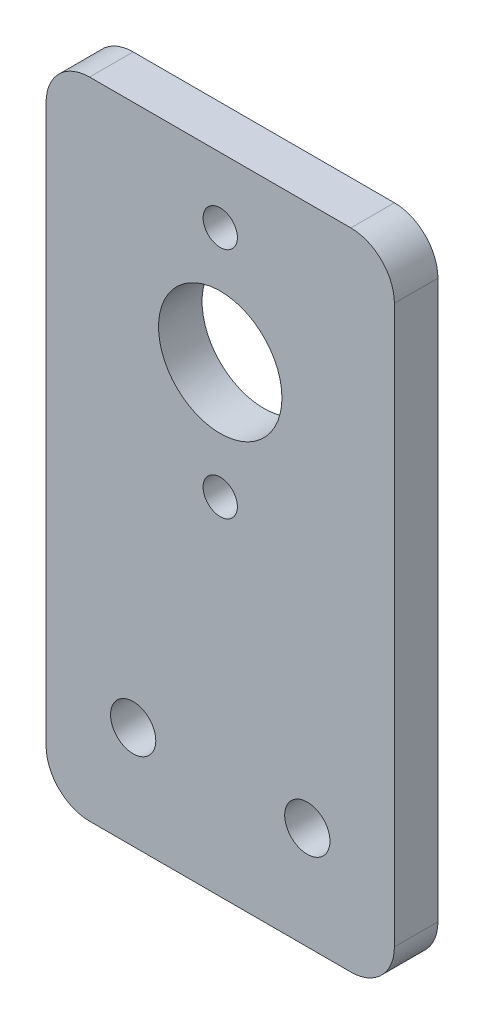
ISO-10303-21;
HEADER;
FILE_DESCRIPTION(('STEP AP214'),'2;1');
FILE_NAME('part.step','',(''),(''),'','','');
FILE_SCHEMA(('AUTOMOTIVE_DESIGN { 1 0 10303 214 1 1 1 1 }'));
ENDSEC;
DATA;
#1=APPLICATION_CONTEXT('core data for automotive mechanical design processes');
#2=APPLICATION_PROTOCOL_DEFINITION('international standard','automotive_design',2000,#1);
#3=PRODUCT_CONTEXT('',#1,'mechanical');
#4=PRODUCT('Part','Part','',(#3));
#5=PRODUCT_RELATED_PRODUCT_CATEGORY('part','',(#4));
#6=PRODUCT_DEFINITION_FORMATION('','',#4);
#7=PRODUCT_DEFINITION_CONTEXT('part definition',#1,'design');
#8=PRODUCT_DEFINITION('design','',#6,#7);
#9=PRODUCT_DEFINITION_SHAPE('','',#8);
#10=(LENGTH_UNIT() NAMED_UNIT(*) SI_UNIT(.MILLI.,.METRE.));
#11=(NAMED_UNIT(*) PLANE_ANGLE_UNIT() SI_UNIT($,.RADIAN.));
#12=(NAMED_UNIT(*) SI_UNIT($,.STERADIAN.) SOLID_ANGLE_UNIT());
#13=UNCERTAINTY_MEASURE_WITH_UNIT(LENGTH_MEASURE(1.E-05),#10,'distance_accuracy_value','');
#14=(GEOMETRIC_REPRESENTATION_CONTEXT(3) GLOBAL_UNCERTAINTY_ASSIGNED_CONTEXT((#13)) GLOBAL_UNIT_ASSIGNED_CONTEXT((#10,
#11,#12)) REPRESENTATION_CONTEXT('',''));
#15=CARTESIAN_POINT('',(0.,0.,0.));
#16=DIRECTION('',(0.,0.,1.));
#17=DIRECTION('',(1.,0.,0.));
#18=AXIS2_PLACEMENT_3D('',#15,#16,#17);
#19=CARTESIAN_POINT('',(12.7,-23.5,3.175));
#20=DIRECTION('',(-1.,0.,0.));
#21=DIRECTION('',(0.,0.,1.));
#22=AXIS2_PLACEMENT_3D('',#19,#20,#21);
#23=PLANE('',#22);
#24=DIRECTION('',(0.,1.,0.));
#25=VECTOR('',#24,1.);
#26=CARTESIAN_POINT('',(12.7,-23.5,3.175));
#27=LINE('',#26,#25);
#28=CARTESIAN_POINT('',(12.7,-20.325,3.175));
#29=VERTEX_POINT('',#28);
#30=CARTESIAN_POINT('',(12.7,20.325,3.175));
#31=VERTEX_POINT('',#30);
#32=EDGE_CURVE('E140',#29,#31,#27,.T.);
#33=ORIENTED_EDGE('',*,*,#32,.F.);
#34=DIRECTION('',(0.,0.,-1.));
#35=VECTOR('',#34,1.);
#36=CARTESIAN_POINT('',(12.7,-20.325,3.175));
#37=LINE('',#36,#35);
#38=CARTESIAN_POINT('',(12.7,-20.325,0.));
#39=VERTEX_POINT('',#38);
#40=EDGE_CURVE('E180',#29,#39,#37,.T.);
#41=ORIENTED_EDGE('',*,*,#40,.T.);
#42=DIRECTION('',(0.,1.,0.));
#43=VECTOR('',#42,1.);
#44=CARTESIAN_POINT('',(12.7,-23.5,0.));
#45=LINE('',#44,#43);
#46=CARTESIAN_POINT('',(12.7,20.325,0.));
#47=VERTEX_POINT('',#46);
#48=EDGE_CURVE('E238',#39,#47,#45,.T.);
#49=ORIENTED_EDGE('',*,*,#48,.T.);
#50=DIRECTION('',(0.,0.,-1.));
#51=VECTOR('',#50,1.);
#52=CARTESIAN_POINT('',(12.7,20.325,3.175));
#53=LINE('',#52,#51);
#54=EDGE_CURVE('E177',#47,#31,#53,.F.);
#55=ORIENTED_EDGE('',*,*,#54,.T.);
#56=EDGE_LOOP('',(#33,#41,#49,#55));
#57=FACE_BOUND('',#56,.T.);
#58=ADVANCED_FACE('F44',(#57),#23,.F.);
#59=CARTESIAN_POINT('',(-12.7,23.5,3.175));
#60=DIRECTION('',(0.,-1.,0.));
#61=DIRECTION('',(0.,0.,-1.));
#62=AXIS2_PLACEMENT_3D('',#59,#60,#61);
#63=PLANE('',#62);
#64=DIRECTION('',(-1.,0.,0.));
#65=VECTOR('',#64,1.);
#66=CARTESIAN_POINT('',(-12.7,23.5,3.175));
#67=LINE('',#66,#65);
#68=CARTESIAN_POINT('',(9.525,23.5,3.175));
#69=VERTEX_POINT('',#68);
#70=CARTESIAN_POINT('',(-9.525,23.5,3.175));
#71=VERTEX_POINT('',#70);
#72=EDGE_CURVE('E146',#69,#71,#67,.T.);
#73=ORIENTED_EDGE('',*,*,#72,.F.);
#74=DIRECTION('',(0.,0.,-1.));
#75=VECTOR('',#74,1.);
#76=CARTESIAN_POINT('',(9.525,23.5,3.175));
#77=LINE('',#76,#75);
#78=CARTESIAN_POINT('',(9.525,23.5,0.));
#79=VERTEX_POINT('',#78);
#80=EDGE_CURVE('E11',#69,#79,#77,.T.);
#81=ORIENTED_EDGE('',*,*,#80,.T.);
#82=DIRECTION('',(-1.,0.,0.));
#83=VECTOR('',#82,1.);
#84=CARTESIAN_POINT('',(-12.7,23.5,0.));
#85=LINE('',#84,#83);
#86=CARTESIAN_POINT('',(-9.525,23.5,0.));
#87=VERTEX_POINT('',#86);
#88=EDGE_CURVE('E148',#79,#87,#85,.T.);
#89=ORIENTED_EDGE('',*,*,#88,.T.);
#90=DIRECTION('',(0.,0.,-1.));
#91=VECTOR('',#90,1.);
#92=CARTESIAN_POINT('',(-9.525,23.5,3.175));
#93=LINE('',#92,#91);
#94=EDGE_CURVE('E53',#87,#71,#93,.F.);
#95=ORIENTED_EDGE('',*,*,#94,.T.);
#96=EDGE_LOOP('',(#73,#81,#89,#95));
#97=FACE_BOUND('',#96,.T.);
#98=ADVANCED_FACE('F325',(#97),#63,.F.);
#99=CARTESIAN_POINT('',(-12.7,-23.5,3.175));
#100=DIRECTION('',(1.,0.,0.));
#101=DIRECTION('',(0.,0.,-1.));
#102=AXIS2_PLACEMENT_3D('',#99,#100,#101);
#103=PLANE('',#102);
#104=DIRECTION('',(0.,-1.,0.));
#105=VECTOR('',#104,1.);
#106=CARTESIAN_POINT('',(-12.7,-23.5,0.));
#107=LINE('',#106,#105);
#108=CARTESIAN_POINT('',(-12.7,20.325,0.));
#109=VERTEX_POINT('',#108);
#110=CARTESIAN_POINT('',(-12.7,-20.325,0.));
#111=VERTEX_POINT('',#110);
#112=EDGE_CURVE('E141',#109,#111,#107,.T.);
#113=ORIENTED_EDGE('',*,*,#112,.T.);
#114=DIRECTION('',(0.,0.,-1.));
#115=VECTOR('',#114,1.);
#116=CARTESIAN_POINT('',(-12.7,-20.325,3.175));
#117=LINE('',#116,#115);
#118=CARTESIAN_POINT('',(-12.7,-20.325,3.175));
#119=VERTEX_POINT('',#118);
#120=EDGE_CURVE('E116',#111,#119,#117,.F.);
#121=ORIENTED_EDGE('',*,*,#120,.T.);
#122=DIRECTION('',(0.,-1.,0.));
#123=VECTOR('',#122,1.);
#124=CARTESIAN_POINT('',(-12.7,-23.5,3.175));
#125=LINE('',#124,#123);
#126=CARTESIAN_POINT('',(-12.7,20.325,3.175));
#127=VERTEX_POINT('',#126);
#128=EDGE_CURVE('E218',#127,#119,#125,.T.);
#129=ORIENTED_EDGE('',*,*,#128,.F.);
#130=DIRECTION('',(0.,0.,-1.));
#131=VECTOR('',#130,1.);
#132=CARTESIAN_POINT('',(-12.7,20.325,3.175));
#133=LINE('',#132,#131);
#134=EDGE_CURVE('E122',#127,#109,#133,.T.);
#135=ORIENTED_EDGE('',*,*,#134,.T.);
#136=EDGE_LOOP('',(#113,#121,#129,#135));
#137=FACE_BOUND('',#136,.T.);
#138=ADVANCED_FACE('F322',(#137),#103,.F.);
#139=CARTESIAN_POINT('',(-12.7,-23.5,3.175));
#140=DIRECTION('',(0.,1.,0.));
#141=DIRECTION('',(0.,0.,1.));
#142=AXIS2_PLACEMENT_3D('',#139,#140,#141);
#143=PLANE('',#142);
#144=DIRECTION('',(1.,0.,0.));
#145=VECTOR('',#144,1.);
#146=CARTESIAN_POINT('',(-12.7,-23.5,3.175));
#147=LINE('',#146,#145);
#148=CARTESIAN_POINT('',(-9.525,-23.5,3.175));
#149=VERTEX_POINT('',#148);
#150=CARTESIAN_POINT('',(9.525,-23.5,3.175));
#151=VERTEX_POINT('',#150);
#152=EDGE_CURVE('E132',#149,#151,#147,.T.);
#153=ORIENTED_EDGE('',*,*,#152,.F.);
#154=DIRECTION('',(0.,0.,-1.));
#155=VECTOR('',#154,1.);
#156=CARTESIAN_POINT('',(-9.525,-23.5,3.175));
#157=LINE('',#156,#155);
#158=CARTESIAN_POINT('',(-9.525,-23.5,0.));
#159=VERTEX_POINT('',#158);
#160=EDGE_CURVE('E115',#149,#159,#157,.T.);
#161=ORIENTED_EDGE('',*,*,#160,.T.);
#162=DIRECTION('',(1.,0.,0.));
#163=VECTOR('',#162,1.);
#164=CARTESIAN_POINT('',(-12.7,-23.5,0.));
#165=LINE('',#164,#163);
#166=CARTESIAN_POINT('',(9.525,-23.5,0.));
#167=VERTEX_POINT('',#166);
#168=EDGE_CURVE('E129',#159,#167,#165,.T.);
#169=ORIENTED_EDGE('',*,*,#168,.T.);
#170=DIRECTION('',(0.,0.,-1.));
#171=VECTOR('',#170,1.);
#172=CARTESIAN_POINT('',(9.525,-23.5,3.175));
#173=LINE('',#172,#171);
#174=EDGE_CURVE('E135',#167,#151,#173,.F.);
#175=ORIENTED_EDGE('',*,*,#174,.T.);
#176=EDGE_LOOP('',(#153,#161,#169,#175));
#177=FACE_BOUND('',#176,.T.);
#178=ADVANCED_FACE('F128',(#177),#143,.F.);
#179=CARTESIAN_POINT('',(0.,0.,3.175));
#180=DIRECTION('',(0.,0.,-1.));
#181=DIRECTION('',(-1.,0.,0.));
#182=AXIS2_PLACEMENT_3D('',#179,#180,#181);
#183=PLANE('',#182);
#184=CARTESIAN_POINT('',(-6.35,-16.,3.175));
#185=DIRECTION('',(0.,0.,1.));
#186=DIRECTION('',(1.,0.,0.));
#187=AXIS2_PLACEMENT_3D('',#184,#185,#186);
#188=CIRCLE('',#187,1.65);
#189=CARTESIAN_POINT('',(-4.7,-16.,3.175));
#190=VERTEX_POINT('',#189);
#191=EDGE_CURVE('E297',#190,#190,#188,.T.);
#192=ORIENTED_EDGE('',*,*,#191,.F.);
#193=EDGE_LOOP('',(#192));
#194=FACE_BOUND('',#193,.T.);
#195=CARTESIAN_POINT('',(6.35,-16.,3.175));
#196=DIRECTION('',(0.,0.,1.));
#197=DIRECTION('',(1.,0.,0.));
#198=AXIS2_PLACEMENT_3D('',#195,#196,#197);
#199=CIRCLE('',#198,1.65);
#200=CARTESIAN_POINT('',(8.,-16.,3.175));
#201=VERTEX_POINT('',#200);
#202=EDGE_CURVE('E285',#201,#201,#199,.T.);
#203=ORIENTED_EDGE('',*,*,#202,.F.);
#204=EDGE_LOOP('',(#203));
#205=FACE_BOUND('',#204,.T.);
#206=CARTESIAN_POINT('',(0.,18.75,3.175));
#207=DIRECTION('',(0.,0.,1.));
#208=DIRECTION('',(1.,0.,0.));
#209=AXIS2_PLACEMENT_3D('',#206,#207,#208);
#210=CIRCLE('',#209,1.24999999999999);
#211=CARTESIAN_POINT('',(1.24999999999999,18.75,3.175));
#212=VERTEX_POINT('',#211);
#213=EDGE_CURVE('E273',#212,#212,#210,.T.);
#214=ORIENTED_EDGE('',*,*,#213,.F.);
#215=EDGE_LOOP('',(#214));
#216=FACE_BOUND('',#215,.T.);
#217=CARTESIAN_POINT('',(0.,1.74999999999999,3.175));
#218=DIRECTION('',(0.,0.,1.));
#219=DIRECTION('',(1.,0.,0.));
#220=AXIS2_PLACEMENT_3D('',#217,#218,#219);
#221=CIRCLE('',#220,1.24999999999999);
#222=CARTESIAN_POINT('',(1.24999999999999,1.74999999999999,3.175));
#223=VERTEX_POINT('',#222);
#224=EDGE_CURVE('E261',#223,#223,#221,.T.);
#225=ORIENTED_EDGE('',*,*,#224,.F.);
#226=EDGE_LOOP('',(#225));
#227=FACE_BOUND('',#226,.T.);
#228=CARTESIAN_POINT('',(0.,10.25,3.175));
#229=DIRECTION('',(0.,0.,1.));
#230=DIRECTION('',(1.,0.,0.));
#231=AXIS2_PLACEMENT_3D('',#228,#229,#230);
#232=CIRCLE('',#231,4.5);
#233=CARTESIAN_POINT('',(4.5,10.25,3.175));
#234=VERTEX_POINT('',#233);
#235=EDGE_CURVE('E249',#234,#234,#232,.T.);
#236=ORIENTED_EDGE('',*,*,#235,.F.);
#237=EDGE_LOOP('',(#236));
#238=FACE_BOUND('',#237,.T.);
#239=ORIENTED_EDGE('',*,*,#128,.T.);
#240=CARTESIAN_POINT('',(-9.525,-20.325,3.175));
#241=DIRECTION('',(0.,0.,-1.));
#242=DIRECTION('',(-1.,0.,0.));
#243=AXIS2_PLACEMENT_3D('',#240,#241,#242);
#244=CIRCLE('',#243,3.175);
#245=EDGE_CURVE('E174',#119,#149,#244,.F.);
#246=ORIENTED_EDGE('',*,*,#245,.T.);
#247=ORIENTED_EDGE('',*,*,#152,.T.);
#248=CARTESIAN_POINT('',(9.525,-20.325,3.175));
#249=DIRECTION('',(0.,0.,-1.));
#250=DIRECTION('',(-1.,0.,0.));
#251=AXIS2_PLACEMENT_3D('',#248,#249,#250);
#252=CIRCLE('',#251,3.175);
#253=EDGE_CURVE('E171',#151,#29,#252,.F.);
#254=ORIENTED_EDGE('',*,*,#253,.T.);
#255=ORIENTED_EDGE('',*,*,#32,.T.);
#256=CARTESIAN_POINT('',(9.525,20.325,3.175));
#257=DIRECTION('',(0.,0.,-1.));
#258=DIRECTION('',(-1.,0.,0.));
#259=AXIS2_PLACEMENT_3D('',#256,#257,#258);
#260=CIRCLE('',#259,3.175);
#261=EDGE_CURVE('E66',#31,#69,#260,.F.);
#262=ORIENTED_EDGE('',*,*,#261,.T.);
#263=ORIENTED_EDGE('',*,*,#72,.T.);
#264=CARTESIAN_POINT('',(-9.525,20.325,3.175));
#265=DIRECTION('',(0.,0.,-1.));
#266=DIRECTION('',(-1.,0.,0.));
#267=AXIS2_PLACEMENT_3D('',#264,#265,#266);
#268=CIRCLE('',#267,3.175);
#269=EDGE_CURVE('E166',#71,#127,#268,.F.);
#270=ORIENTED_EDGE('',*,*,#269,.T.);
#271=EDGE_LOOP('',(#239,#246,#247,#254,#255,#262,#263,#270));
#272=FACE_BOUND('',#271,.T.);
#273=ADVANCED_FACE('F307',(#194,#205,#216,#227,#238,#272),#183,.F.);
#274=CARTESIAN_POINT('',(0.,0.,0.));
#275=DIRECTION('',(0.,0.,-1.));
#276=DIRECTION('',(-1.,0.,0.));
#277=AXIS2_PLACEMENT_3D('',#274,#275,#276);
#278=PLANE('',#277);
#279=CARTESIAN_POINT('',(-6.35,-16.,0.));
#280=DIRECTION('',(0.,0.,1.));
#281=DIRECTION('',(1.,0.,0.));
#282=AXIS2_PLACEMENT_3D('',#279,#280,#281);
#283=CIRCLE('',#282,1.65);
#284=CARTESIAN_POINT('',(-4.7,-16.,0.));
#285=VERTEX_POINT('',#284);
#286=EDGE_CURVE('E291',#285,#285,#283,.T.);
#287=ORIENTED_EDGE('',*,*,#286,.T.);
#288=EDGE_LOOP('',(#287));
#289=FACE_BOUND('',#288,.T.);
#290=CARTESIAN_POINT('',(6.35,-16.,0.));
#291=DIRECTION('',(0.,0.,1.));
#292=DIRECTION('',(1.,0.,0.));
#293=AXIS2_PLACEMENT_3D('',#290,#291,#292);
#294=CIRCLE('',#293,1.65);
#295=CARTESIAN_POINT('',(8.,-16.,0.));
#296=VERTEX_POINT('',#295);
#297=EDGE_CURVE('E279',#296,#296,#294,.T.);
#298=ORIENTED_EDGE('',*,*,#297,.T.);
#299=EDGE_LOOP('',(#298));
#300=FACE_BOUND('',#299,.T.);
#301=CARTESIAN_POINT('',(0.,18.75,0.));
#302=DIRECTION('',(0.,0.,1.));
#303=DIRECTION('',(1.,0.,0.));
#304=AXIS2_PLACEMENT_3D('',#301,#302,#303);
#305=CIRCLE('',#304,1.25);
#306=CARTESIAN_POINT('',(1.25,18.75,0.));
#307=VERTEX_POINT('',#306);
#308=EDGE_CURVE('E267',#307,#307,#305,.T.);
#309=ORIENTED_EDGE('',*,*,#308,.T.);
#310=EDGE_LOOP('',(#309));
#311=FACE_BOUND('',#310,.T.);
#312=CARTESIAN_POINT('',(0.,1.74999999999999,0.));
#313=DIRECTION('',(0.,0.,1.));
#314=DIRECTION('',(1.,0.,0.));
#315=AXIS2_PLACEMENT_3D('',#312,#313,#314);
#316=CIRCLE('',#315,1.25);
#317=CARTESIAN_POINT('',(1.25,1.74999999999999,0.));
#318=VERTEX_POINT('',#317);
#319=EDGE_CURVE('E255',#318,#318,#316,.T.);
#320=ORIENTED_EDGE('',*,*,#319,.T.);
#321=EDGE_LOOP('',(#320));
#322=FACE_BOUND('',#321,.T.);
#323=CARTESIAN_POINT('',(0.,10.25,0.));
#324=DIRECTION('',(0.,0.,1.));
#325=DIRECTION('',(1.,0.,0.));
#326=AXIS2_PLACEMENT_3D('',#323,#324,#325);
#327=CIRCLE('',#326,4.5);
#328=CARTESIAN_POINT('',(4.5,10.25,0.));
#329=VERTEX_POINT('',#328);
#330=EDGE_CURVE('E243',#329,#329,#327,.T.);
#331=ORIENTED_EDGE('',*,*,#330,.T.);
#332=EDGE_LOOP('',(#331));
#333=FACE_BOUND('',#332,.T.);
#334=ORIENTED_EDGE('',*,*,#168,.F.);
#335=CARTESIAN_POINT('',(-9.525,-20.325,0.));
#336=DIRECTION('',(0.,0.,-1.));
#337=DIRECTION('',(-1.,0.,0.));
#338=AXIS2_PLACEMENT_3D('',#335,#336,#337);
#339=CIRCLE('',#338,3.175);
#340=EDGE_CURVE('E111',#159,#111,#339,.T.);
#341=ORIENTED_EDGE('',*,*,#340,.T.);
#342=ORIENTED_EDGE('',*,*,#112,.F.);
#343=CARTESIAN_POINT('',(-9.525,20.325,0.));
#344=DIRECTION('',(0.,0.,-1.));
#345=DIRECTION('',(-1.,0.,0.));
#346=AXIS2_PLACEMENT_3D('',#343,#344,#345);
#347=CIRCLE('',#346,3.175);
#348=EDGE_CURVE('E134',#109,#87,#347,.T.);
#349=ORIENTED_EDGE('',*,*,#348,.T.);
#350=ORIENTED_EDGE('',*,*,#88,.F.);
#351=CARTESIAN_POINT('',(9.525,20.325,0.));
#352=DIRECTION('',(0.,0.,-1.));
#353=DIRECTION('',(-1.,0.,0.));
#354=AXIS2_PLACEMENT_3D('',#351,#352,#353);
#355=CIRCLE('',#354,3.175);
#356=EDGE_CURVE('E156',#79,#47,#355,.T.);
#357=ORIENTED_EDGE('',*,*,#356,.T.);
#358=ORIENTED_EDGE('',*,*,#48,.F.);
#359=CARTESIAN_POINT('',(9.525,-20.325,0.));
#360=DIRECTION('',(0.,0.,-1.));
#361=DIRECTION('',(-1.,0.,0.));
#362=AXIS2_PLACEMENT_3D('',#359,#360,#361);
#363=CIRCLE('',#362,3.175);
#364=EDGE_CURVE('E123',#39,#167,#363,.T.);
#365=ORIENTED_EDGE('',*,*,#364,.T.);
#366=EDGE_LOOP('',(#334,#341,#342,#349,#350,#357,#358,#365));
#367=FACE_BOUND('',#366,.T.);
#368=ADVANCED_FACE('F137',(#289,#300,#311,#322,#333,#367),#278,.T.);
#369=CARTESIAN_POINT('',(0.,10.25,0.));
#370=DIRECTION('',(0.,0.,1.));
#371=DIRECTION('',(1.,0.,0.));
#372=AXIS2_PLACEMENT_3D('',#369,#370,#371);
#373=CYLINDRICAL_SURFACE('',#372,4.5);
#374=ORIENTED_EDGE('',*,*,#330,.F.);
#375=EDGE_LOOP('',(#374));
#376=FACE_BOUND('',#375,.T.);
#377=ORIENTED_EDGE('',*,*,#235,.T.);
#378=EDGE_LOOP('',(#377));
#379=FACE_BOUND('',#378,.T.);
#380=ADVANCED_FACE('F356',(#376,#379),#373,.F.);
#381=CARTESIAN_POINT('',(0.,1.74999999999999,3.175));
#382=DIRECTION('',(0.,0.,1.));
#383=DIRECTION('',(1.,0.,0.));
#384=AXIS2_PLACEMENT_3D('',#381,#382,#383);
#385=CYLINDRICAL_SURFACE('',#384,1.24999999999999);
#386=ORIENTED_EDGE('',*,*,#319,.F.);
#387=EDGE_LOOP('',(#386));
#388=FACE_BOUND('',#387,.T.);
#389=ORIENTED_EDGE('',*,*,#224,.T.);
#390=EDGE_LOOP('',(#389));
#391=FACE_BOUND('',#390,.T.);
#392=ADVANCED_FACE('F361',(#388,#391),#385,.F.);
#393=CARTESIAN_POINT('',(0.,18.75,3.175));
#394=DIRECTION('',(0.,0.,1.));
#395=DIRECTION('',(1.,0.,0.));
#396=AXIS2_PLACEMENT_3D('',#393,#394,#395);
#397=CYLINDRICAL_SURFACE('',#396,1.24999999999999);
#398=ORIENTED_EDGE('',*,*,#308,.F.);
#399=EDGE_LOOP('',(#398));
#400=FACE_BOUND('',#399,.T.);
#401=ORIENTED_EDGE('',*,*,#213,.T.);
#402=EDGE_LOOP('',(#401));
#403=FACE_BOUND('',#402,.T.);
#404=ADVANCED_FACE('F342',(#400,#403),#397,.F.);
#405=CARTESIAN_POINT('',(-9.525,-20.325,3.175));
#406=DIRECTION('',(0.,0.,-1.));
#407=DIRECTION('',(-1.,0.,0.));
#408=AXIS2_PLACEMENT_3D('',#405,#406,#407);
#409=CYLINDRICAL_SURFACE('',#408,3.175);
#410=ORIENTED_EDGE('',*,*,#245,.F.);
#411=ORIENTED_EDGE('',*,*,#120,.F.);
#412=ORIENTED_EDGE('',*,*,#340,.F.);
#413=ORIENTED_EDGE('',*,*,#160,.F.);
#414=EDGE_LOOP('',(#410,#411,#412,#413));
#415=FACE_BOUND('',#414,.T.);
#416=ADVANCED_FACE('F114',(#415),#409,.T.);
#417=CARTESIAN_POINT('',(9.525,-20.325,3.175));
#418=DIRECTION('',(0.,0.,-1.));
#419=DIRECTION('',(-1.,0.,0.));
#420=AXIS2_PLACEMENT_3D('',#417,#418,#419);
#421=CYLINDRICAL_SURFACE('',#420,3.175);
#422=ORIENTED_EDGE('',*,*,#253,.F.);
#423=ORIENTED_EDGE('',*,*,#174,.F.);
#424=ORIENTED_EDGE('',*,*,#364,.F.);
#425=ORIENTED_EDGE('',*,*,#40,.F.);
#426=EDGE_LOOP('',(#422,#423,#424,#425));
#427=FACE_BOUND('',#426,.T.);
#428=ADVANCED_FACE('F335',(#427),#421,.T.);
#429=CARTESIAN_POINT('',(9.525,20.325,3.175));
#430=DIRECTION('',(0.,0.,-1.));
#431=DIRECTION('',(-1.,0.,0.));
#432=AXIS2_PLACEMENT_3D('',#429,#430,#431);
#433=CYLINDRICAL_SURFACE('',#432,3.175);
#434=ORIENTED_EDGE('',*,*,#261,.F.);
#435=ORIENTED_EDGE('',*,*,#54,.F.);
#436=ORIENTED_EDGE('',*,*,#356,.F.);
#437=ORIENTED_EDGE('',*,*,#80,.F.);
#438=EDGE_LOOP('',(#434,#435,#436,#437));
#439=FACE_BOUND('',#438,.T.);
#440=ADVANCED_FACE('F328',(#439),#433,.T.);
#441=CARTESIAN_POINT('',(-9.525,20.325,3.175));
#442=DIRECTION('',(0.,0.,-1.));
#443=DIRECTION('',(-1.,0.,0.));
#444=AXIS2_PLACEMENT_3D('',#441,#442,#443);
#445=CYLINDRICAL_SURFACE('',#444,3.175);
#446=ORIENTED_EDGE('',*,*,#269,.F.);
#447=ORIENTED_EDGE('',*,*,#94,.F.);
#448=ORIENTED_EDGE('',*,*,#348,.F.);
#449=ORIENTED_EDGE('',*,*,#134,.F.);
#450=EDGE_LOOP('',(#446,#447,#448,#449));
#451=FACE_BOUND('',#450,.T.);
#452=ADVANCED_FACE('F46',(#451),#445,.T.);
#453=CARTESIAN_POINT('',(6.35,-16.,3.175));
#454=DIRECTION('',(0.,0.,1.));
#455=DIRECTION('',(1.,0.,0.));
#456=AXIS2_PLACEMENT_3D('',#453,#454,#455);
#457=CYLINDRICAL_SURFACE('',#456,1.65);
#458=ORIENTED_EDGE('',*,*,#297,.F.);
#459=EDGE_LOOP('',(#458));
#460=FACE_BOUND('',#459,.T.);
#461=ORIENTED_EDGE('',*,*,#202,.T.);
#462=EDGE_LOOP('',(#461));
#463=FACE_BOUND('',#462,.T.);
#464=ADVANCED_FACE('F369',(#460,#463),#457,.F.);
#465=CARTESIAN_POINT('',(-6.35,-16.,3.175));
#466=DIRECTION('',(0.,0.,1.));
#467=DIRECTION('',(1.,0.,0.));
#468=AXIS2_PLACEMENT_3D('',#465,#466,#467);
#469=CYLINDRICAL_SURFACE('',#468,1.65);
#470=ORIENTED_EDGE('',*,*,#286,.F.);
#471=EDGE_LOOP('',(#470));
#472=FACE_BOUND('',#471,.T.);
#473=ORIENTED_EDGE('',*,*,#191,.T.);
#474=EDGE_LOOP('',(#473));
#475=FACE_BOUND('',#474,.T.);
#476=ADVANCED_FACE('F305',(#472,#475),#469,.F.);
#477=CLOSED_SHELL('',(#58,#98,#138,#178,#273,#368,#380,#392,#404,#416,#428,#440,#452,#464,#476));
#478=MANIFOLD_SOLID_BREP('B2',#477);
#479=ADVANCED_BREP_SHAPE_REPRESENTATION('',(#18,#478),#14);
#480=SHAPE_DEFINITION_REPRESENTATION(#9,#479);
ENDSEC;
END-ISO-10303-21;
